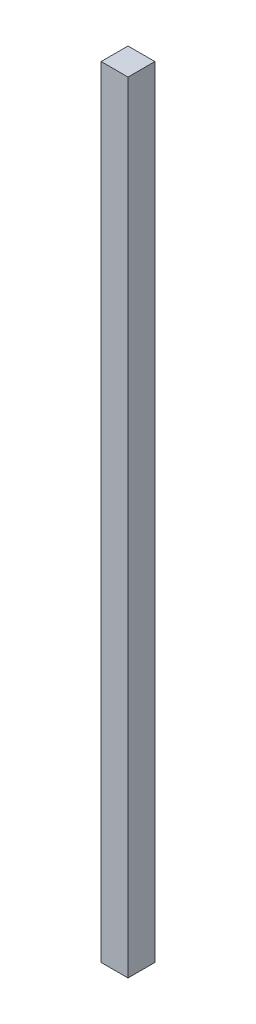
ISO-10303-21;
HEADER;
FILE_DESCRIPTION(('STEP AP214'),'2;1');
FILE_NAME('part.step','',(''),(''),'','','');
FILE_SCHEMA(('AUTOMOTIVE_DESIGN { 1 0 10303 214 1 1 1 1 }'));
ENDSEC;
DATA;
#1=APPLICATION_CONTEXT('core data for automotive mechanical design processes');
#2=APPLICATION_PROTOCOL_DEFINITION('international standard','automotive_design',2000,#1);
#3=PRODUCT_CONTEXT('',#1,'mechanical');
#4=PRODUCT('Part','Part','',(#3));
#5=PRODUCT_RELATED_PRODUCT_CATEGORY('part','',(#4));
#6=PRODUCT_DEFINITION_FORMATION('','',#4);
#7=PRODUCT_DEFINITION_CONTEXT('part definition',#1,'design');
#8=PRODUCT_DEFINITION('design','',#6,#7);
#9=PRODUCT_DEFINITION_SHAPE('','',#8);
#10=(LENGTH_UNIT() NAMED_UNIT(*) SI_UNIT(.MILLI.,.METRE.));
#11=(NAMED_UNIT(*) PLANE_ANGLE_UNIT() SI_UNIT($,.RADIAN.));
#12=(NAMED_UNIT(*) SI_UNIT($,.STERADIAN.) SOLID_ANGLE_UNIT());
#13=UNCERTAINTY_MEASURE_WITH_UNIT(LENGTH_MEASURE(1.E-05),#10,'distance_accuracy_value','');
#14=(GEOMETRIC_REPRESENTATION_CONTEXT(3) GLOBAL_UNCERTAINTY_ASSIGNED_CONTEXT((#13)) GLOBAL_UNIT_ASSIGNED_CONTEXT((#10,
#11,#12)) REPRESENTATION_CONTEXT('',''));
#15=CARTESIAN_POINT('',(0.,0.,0.));
#16=DIRECTION('',(0.,0.,1.));
#17=DIRECTION('',(1.,0.,0.));
#18=AXIS2_PLACEMENT_3D('',#15,#16,#17);
#19=CARTESIAN_POINT('',(0.,-290.,10.));
#20=DIRECTION('',(1.,0.,0.));
#21=DIRECTION('',(0.,0.,-1.));
#22=AXIS2_PLACEMENT_3D('',#19,#20,#21);
#23=PLANE('',#22);
#24=DIRECTION('',(0.,-1.,0.));
#25=VECTOR('',#24,1.);
#26=CARTESIAN_POINT('',(0.,-290.,0.));
#27=LINE('',#26,#25);
#28=CARTESIAN_POINT('',(0.,0.,0.));
#29=VERTEX_POINT('',#28);
#30=CARTESIAN_POINT('',(0.,-290.,0.));
#31=VERTEX_POINT('',#30);
#32=EDGE_CURVE('E107',#29,#31,#27,.T.);
#33=ORIENTED_EDGE('',*,*,#32,.T.);
#34=DIRECTION('',(0.,0.,-1.));
#35=VECTOR('',#34,1.);
#36=CARTESIAN_POINT('',(0.,-290.,10.));
#37=LINE('',#36,#35);
#38=CARTESIAN_POINT('',(0.,-290.,10.));
#39=VERTEX_POINT('',#38);
#40=EDGE_CURVE('E11',#39,#31,#37,.T.);
#41=ORIENTED_EDGE('',*,*,#40,.F.);
#42=DIRECTION('',(0.,-1.,0.));
#43=VECTOR('',#42,1.);
#44=CARTESIAN_POINT('',(0.,-290.,10.));
#45=LINE('',#44,#43);
#46=CARTESIAN_POINT('',(0.,0.,10.));
#47=VERTEX_POINT('',#46);
#48=EDGE_CURVE('E91',#47,#39,#45,.T.);
#49=ORIENTED_EDGE('',*,*,#48,.F.);
#50=DIRECTION('',(0.,0.,-1.));
#51=VECTOR('',#50,1.);
#52=CARTESIAN_POINT('',(0.,0.,10.));
#53=LINE('',#52,#51);
#54=EDGE_CURVE('E103',#47,#29,#53,.T.);
#55=ORIENTED_EDGE('',*,*,#54,.T.);
#56=EDGE_LOOP('',(#33,#41,#49,#55));
#57=FACE_BOUND('',#56,.T.);
#58=ADVANCED_FACE('F39',(#57),#23,.F.);
#59=CARTESIAN_POINT('',(10.,-290.,10.));
#60=DIRECTION('',(0.,1.,0.));
#61=DIRECTION('',(0.,0.,1.));
#62=AXIS2_PLACEMENT_3D('',#59,#60,#61);
#63=PLANE('',#62);
#64=DIRECTION('',(1.,0.,0.));
#65=VECTOR('',#64,1.);
#66=CARTESIAN_POINT('',(10.,-290.,0.));
#67=LINE('',#66,#65);
#68=CARTESIAN_POINT('',(10.,-290.,0.));
#69=VERTEX_POINT('',#68);
#70=EDGE_CURVE('E96',#31,#69,#67,.T.);
#71=ORIENTED_EDGE('',*,*,#70,.T.);
#72=DIRECTION('',(0.,0.,-1.));
#73=VECTOR('',#72,1.);
#74=CARTESIAN_POINT('',(10.,-290.,10.));
#75=LINE('',#74,#73);
#76=CARTESIAN_POINT('',(10.,-290.,10.));
#77=VERTEX_POINT('',#76);
#78=EDGE_CURVE('E48',#77,#69,#75,.T.);
#79=ORIENTED_EDGE('',*,*,#78,.F.);
#80=DIRECTION('',(1.,0.,0.));
#81=VECTOR('',#80,1.);
#82=CARTESIAN_POINT('',(10.,-290.,10.));
#83=LINE('',#82,#81);
#84=EDGE_CURVE('E86',#39,#77,#83,.T.);
#85=ORIENTED_EDGE('',*,*,#84,.F.);
#86=ORIENTED_EDGE('',*,*,#40,.T.);
#87=EDGE_LOOP('',(#71,#79,#85,#86));
#88=FACE_BOUND('',#87,.T.);
#89=ADVANCED_FACE('F95',(#88),#63,.F.);
#90=CARTESIAN_POINT('',(10.,0.,10.));
#91=DIRECTION('',(-1.,0.,0.));
#92=DIRECTION('',(0.,-1.,0.));
#93=AXIS2_PLACEMENT_3D('',#90,#91,#92);
#94=PLANE('',#93);
#95=DIRECTION('',(0.,1.,0.));
#96=VECTOR('',#95,1.);
#97=CARTESIAN_POINT('',(10.,0.,0.));
#98=LINE('',#97,#96);
#99=CARTESIAN_POINT('',(10.,0.,0.));
#100=VERTEX_POINT('',#99);
#101=EDGE_CURVE('E73',#69,#100,#98,.T.);
#102=ORIENTED_EDGE('',*,*,#101,.T.);
#103=DIRECTION('',(0.,0.,-1.));
#104=VECTOR('',#103,1.);
#105=CARTESIAN_POINT('',(10.,0.,10.));
#106=LINE('',#105,#104);
#107=CARTESIAN_POINT('',(10.,0.,10.));
#108=VERTEX_POINT('',#107);
#109=EDGE_CURVE('E98',#108,#100,#106,.T.);
#110=ORIENTED_EDGE('',*,*,#109,.F.);
#111=DIRECTION('',(0.,1.,0.));
#112=VECTOR('',#111,1.);
#113=CARTESIAN_POINT('',(10.,0.,10.));
#114=LINE('',#113,#112);
#115=EDGE_CURVE('E89',#77,#108,#114,.T.);
#116=ORIENTED_EDGE('',*,*,#115,.F.);
#117=ORIENTED_EDGE('',*,*,#78,.T.);
#118=EDGE_LOOP('',(#102,#110,#116,#117));
#119=FACE_BOUND('',#118,.T.);
#120=ADVANCED_FACE('F99',(#119),#94,.F.);
#121=CARTESIAN_POINT('',(0.,0.,10.));
#122=DIRECTION('',(0.,-1.,0.));
#123=DIRECTION('',(0.,0.,-1.));
#124=AXIS2_PLACEMENT_3D('',#121,#122,#123);
#125=PLANE('',#124);
#126=DIRECTION('',(-1.,0.,0.));
#127=VECTOR('',#126,1.);
#128=CARTESIAN_POINT('',(0.,0.,0.));
#129=LINE('',#128,#127);
#130=EDGE_CURVE('E79',#100,#29,#129,.T.);
#131=ORIENTED_EDGE('',*,*,#130,.T.);
#132=ORIENTED_EDGE('',*,*,#54,.F.);
#133=DIRECTION('',(-1.,0.,0.));
#134=VECTOR('',#133,1.);
#135=CARTESIAN_POINT('',(0.,0.,10.));
#136=LINE('',#135,#134);
#137=EDGE_CURVE('E56',#108,#47,#136,.T.);
#138=ORIENTED_EDGE('',*,*,#137,.F.);
#139=ORIENTED_EDGE('',*,*,#109,.T.);
#140=EDGE_LOOP('',(#131,#132,#138,#139));
#141=FACE_BOUND('',#140,.T.);
#142=ADVANCED_FACE('F120',(#141),#125,.F.);
#143=CARTESIAN_POINT('',(0.,0.,10.));
#144=DIRECTION('',(0.,0.,-1.));
#145=DIRECTION('',(-1.,0.,0.));
#146=AXIS2_PLACEMENT_3D('',#143,#144,#145);
#147=PLANE('',#146);
#148=ORIENTED_EDGE('',*,*,#48,.T.);
#149=ORIENTED_EDGE('',*,*,#84,.T.);
#150=ORIENTED_EDGE('',*,*,#115,.T.);
#151=ORIENTED_EDGE('',*,*,#137,.T.);
#152=EDGE_LOOP('',(#148,#149,#150,#151));
#153=FACE_BOUND('',#152,.T.);
#154=ADVANCED_FACE('F87',(#153),#147,.F.);
#155=CARTESIAN_POINT('',(0.,0.,0.));
#156=DIRECTION('',(0.,0.,-1.));
#157=DIRECTION('',(-1.,0.,0.));
#158=AXIS2_PLACEMENT_3D('',#155,#156,#157);
#159=PLANE('',#158);
#160=ORIENTED_EDGE('',*,*,#32,.F.);
#161=ORIENTED_EDGE('',*,*,#130,.F.);
#162=ORIENTED_EDGE('',*,*,#101,.F.);
#163=ORIENTED_EDGE('',*,*,#70,.F.);
#164=EDGE_LOOP('',(#160,#161,#162,#163));
#165=FACE_BOUND('',#164,.T.);
#166=ADVANCED_FACE('F123',(#165),#159,.T.);
#167=CLOSED_SHELL('',(#58,#89,#120,#142,#154,#166));
#168=MANIFOLD_SOLID_BREP('B2',#167);
#169=ADVANCED_BREP_SHAPE_REPRESENTATION('',(#18,#168),#14);
#170=SHAPE_DEFINITION_REPRESENTATION(#9,#169);
ENDSEC;
END-ISO-10303-21;
